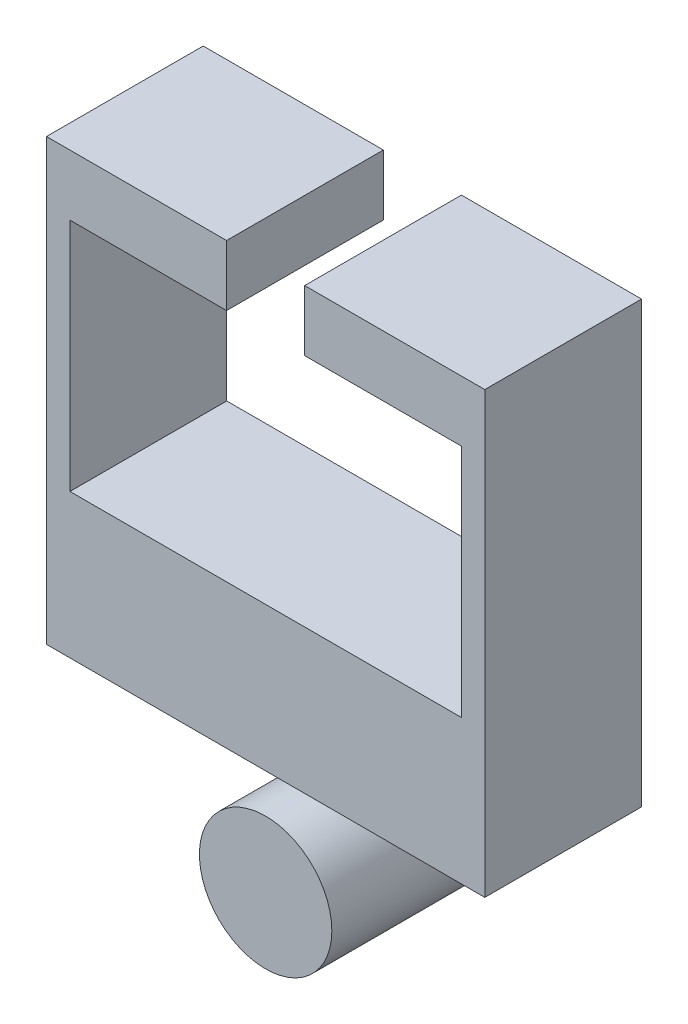
ISO-10303-21;
HEADER;
FILE_DESCRIPTION(('STEP AP214'),'2;1');
FILE_NAME('part.step','',(''),(''),'','','');
FILE_SCHEMA(('AUTOMOTIVE_DESIGN { 1 0 10303 214 1 1 1 1 }'));
ENDSEC;
DATA;
#1=APPLICATION_CONTEXT('core data for automotive mechanical design processes');
#2=APPLICATION_PROTOCOL_DEFINITION('international standard','automotive_design',2000,#1);
#3=PRODUCT_CONTEXT('',#1,'mechanical');
#4=PRODUCT('Part','Part','',(#3));
#5=PRODUCT_RELATED_PRODUCT_CATEGORY('part','',(#4));
#6=PRODUCT_DEFINITION_FORMATION('','',#4);
#7=PRODUCT_DEFINITION_CONTEXT('part definition',#1,'design');
#8=PRODUCT_DEFINITION('design','',#6,#7);
#9=PRODUCT_DEFINITION_SHAPE('','',#8);
#10=(LENGTH_UNIT() NAMED_UNIT(*) SI_UNIT(.MILLI.,.METRE.));
#11=(NAMED_UNIT(*) PLANE_ANGLE_UNIT() SI_UNIT($,.RADIAN.));
#12=(NAMED_UNIT(*) SI_UNIT($,.STERADIAN.) SOLID_ANGLE_UNIT());
#13=UNCERTAINTY_MEASURE_WITH_UNIT(LENGTH_MEASURE(1.E-05),#10,'distance_accuracy_value','');
#14=(GEOMETRIC_REPRESENTATION_CONTEXT(3) GLOBAL_UNCERTAINTY_ASSIGNED_CONTEXT((#13)) GLOBAL_UNIT_ASSIGNED_CONTEXT((#10,
#11,#12)) REPRESENTATION_CONTEXT('',''));
#15=CARTESIAN_POINT('',(0.,0.,0.));
#16=DIRECTION('',(0.,0.,1.));
#17=DIRECTION('',(1.,0.,0.));
#18=AXIS2_PLACEMENT_3D('',#15,#16,#17);
#19=CARTESIAN_POINT('',(0.,0.,25.4));
#20=DIRECTION('',(0.,0.,-1.));
#21=DIRECTION('',(-1.,0.,0.));
#22=AXIS2_PLACEMENT_3D('',#19,#20,#21);
#23=CYLINDRICAL_SURFACE('',#22,10.7286789250919);
#24=CARTESIAN_POINT('',(0.,0.,25.4));
#25=DIRECTION('',(0.,0.,1.));
#26=DIRECTION('',(1.,0.,0.));
#27=AXIS2_PLACEMENT_3D('',#24,#25,#26);
#28=CIRCLE('',#27,10.7286789250919);
#29=CARTESIAN_POINT('',(10.7286789250919,0.,25.4));
#30=VERTEX_POINT('',#29);
#31=EDGE_CURVE('E854',#30,#30,#28,.T.);
#32=ORIENTED_EDGE('',*,*,#31,.F.);
#33=EDGE_LOOP('',(#32));
#34=FACE_BOUND('',#33,.T.);
#35=DIRECTION('',(0.,0.,1.));
#36=VECTOR('',#35,1.);
#37=CARTESIAN_POINT('',(10.7286789250919,0.,0.));
#38=LINE('',#37,#36);
#39=CARTESIAN_POINT('',(10.7286789250919,0.,0.));
#40=VERTEX_POINT('',#39);
#41=CARTESIAN_POINT('',(10.7286789250919,0.,4.04101495652024));
#42=VERTEX_POINT('',#41);
#43=EDGE_CURVE('E865',#40,#42,#38,.T.);
#44=ORIENTED_EDGE('',*,*,#43,.T.);
#45=CARTESIAN_POINT('',(0.,0.,4.04101495652024));
#46=DIRECTION('',(0.,0.,-1.));
#47=DIRECTION('',(-1.,0.,0.));
#48=AXIS2_PLACEMENT_3D('',#45,#46,#47);
#49=CIRCLE('',#48,10.7286789250919);
#50=CARTESIAN_POINT('',(-10.7286789250919,0.,4.04101495652024));
#51=VERTEX_POINT('',#50);
#52=EDGE_CURVE('E14',#51,#42,#49,.T.);
#53=ORIENTED_EDGE('',*,*,#52,.F.);
#54=DIRECTION('',(0.,0.,-1.));
#55=VECTOR('',#54,1.);
#56=CARTESIAN_POINT('',(-10.7286789250919,0.,0.));
#57=LINE('',#56,#55);
#58=CARTESIAN_POINT('',(-10.7286789250919,0.,0.));
#59=VERTEX_POINT('',#58);
#60=EDGE_CURVE('E866',#51,#59,#57,.T.);
#61=ORIENTED_EDGE('',*,*,#60,.T.);
#62=CARTESIAN_POINT('',(0.,0.,0.));
#63=DIRECTION('',(0.,0.,1.));
#64=DIRECTION('',(1.,0.,0.));
#65=AXIS2_PLACEMENT_3D('',#62,#63,#64);
#66=CIRCLE('',#65,10.7286789250919);
#67=EDGE_CURVE('E1056',#59,#40,#66,.T.);
#68=ORIENTED_EDGE('',*,*,#67,.T.);
#69=EDGE_LOOP('',(#44,#53,#61,#68));
#70=FACE_BOUND('',#69,.T.);
#71=ADVANCED_FACE('F849',(#34,#70),#23,.T.);
#72=CARTESIAN_POINT('',(0.,0.,25.4));
#73=DIRECTION('',(0.,0.,1.));
#74=DIRECTION('',(1.,0.,0.));
#75=AXIS2_PLACEMENT_3D('',#72,#73,#74);
#76=PLANE('',#75);
#77=ORIENTED_EDGE('',*,*,#31,.T.);
#78=EDGE_LOOP('',(#77));
#79=FACE_BOUND('',#78,.T.);
#80=ADVANCED_FACE('F1203',(#79),#76,.T.);
#81=CARTESIAN_POINT('',(0.,0.,0.));
#82=DIRECTION('',(0.,0.,1.));
#83=DIRECTION('',(1.,0.,0.));
#84=AXIS2_PLACEMENT_3D('',#81,#82,#83);
#85=PLANE('',#84);
#86=ORIENTED_EDGE('',*,*,#67,.F.);
#87=DIRECTION('',(0.,1.,0.));
#88=VECTOR('',#87,1.);
#89=CARTESIAN_POINT('',(-10.7286789250919,0.,0.));
#90=LINE('',#89,#88);
#91=CARTESIAN_POINT('',(-10.7286789250919,17.0688,0.));
#92=VERTEX_POINT('',#91);
#93=EDGE_CURVE('E1059',#59,#92,#90,.T.);
#94=ORIENTED_EDGE('',*,*,#93,.T.);
#95=DIRECTION('',(1.,0.,0.));
#96=VECTOR('',#95,1.);
#97=CARTESIAN_POINT('',(-35.51174,17.0688,0.));
#98=LINE('',#97,#96);
#99=CARTESIAN_POINT('',(-35.51174,17.0688,0.));
#100=VERTEX_POINT('',#99);
#101=EDGE_CURVE('E984',#100,#92,#98,.T.);
#102=ORIENTED_EDGE('',*,*,#101,.F.);
#103=DIRECTION('',(0.,-1.,0.));
#104=VECTOR('',#103,1.);
#105=CARTESIAN_POINT('',(-35.51174,88.3367551933248,0.));
#106=LINE('',#105,#104);
#107=CARTESIAN_POINT('',(-35.51174,88.3367551933248,0.));
#108=VERTEX_POINT('',#107);
#109=EDGE_CURVE('E978',#108,#100,#106,.T.);
#110=ORIENTED_EDGE('',*,*,#109,.F.);
#111=DIRECTION('',(-1.,0.,0.));
#112=VECTOR('',#111,1.);
#113=CARTESIAN_POINT('',(-6.32459999999997,88.3367551933248,0.));
#114=LINE('',#113,#112);
#115=CARTESIAN_POINT('',(-6.32459999999997,88.3367551933248,0.));
#116=VERTEX_POINT('',#115);
#117=EDGE_CURVE('E960',#116,#108,#114,.T.);
#118=ORIENTED_EDGE('',*,*,#117,.F.);
#119=DIRECTION('',(0.,1.,0.));
#120=VECTOR('',#119,1.);
#121=CARTESIAN_POINT('',(-6.32459999999998,78.5033132323429,0.));
#122=LINE('',#121,#120);
#123=CARTESIAN_POINT('',(-6.32459999999998,78.5033132323429,0.));
#124=VERTEX_POINT('',#123);
#125=EDGE_CURVE('E973',#124,#116,#122,.T.);
#126=ORIENTED_EDGE('',*,*,#125,.F.);
#127=DIRECTION('',(1.,0.,0.));
#128=VECTOR('',#127,1.);
#129=CARTESIAN_POINT('',(-31.70428,78.5033132323429,0.));
#130=LINE('',#129,#128);
#131=CARTESIAN_POINT('',(-31.70428,78.5033132323429,0.));
#132=VERTEX_POINT('',#131);
#133=EDGE_CURVE('E1121',#132,#124,#130,.T.);
#134=ORIENTED_EDGE('',*,*,#133,.F.);
#135=DIRECTION('',(0.,1.,0.));
#136=VECTOR('',#135,1.);
#137=CARTESIAN_POINT('',(-31.70428,40.4287132323429,0.));
#138=LINE('',#137,#136);
#139=CARTESIAN_POINT('',(-31.70428,40.4287132323429,0.));
#140=VERTEX_POINT('',#139);
#141=EDGE_CURVE('E1127',#140,#132,#138,.T.);
#142=ORIENTED_EDGE('',*,*,#141,.F.);
#143=DIRECTION('',(-1.,0.,0.));
#144=VECTOR('',#143,1.);
#145=CARTESIAN_POINT('',(31.70428,40.4287132323429,0.));
#146=LINE('',#145,#144);
#147=CARTESIAN_POINT('',(31.70428,40.4287132323429,0.));
#148=VERTEX_POINT('',#147);
#149=EDGE_CURVE('E1133',#148,#140,#146,.T.);
#150=ORIENTED_EDGE('',*,*,#149,.F.);
#151=DIRECTION('',(0.,-1.,0.));
#152=VECTOR('',#151,1.);
#153=CARTESIAN_POINT('',(31.70428,78.5033132323429,0.));
#154=LINE('',#153,#152);
#155=CARTESIAN_POINT('',(31.70428,78.5033132323429,0.));
#156=VERTEX_POINT('',#155);
#157=EDGE_CURVE('E1135',#156,#148,#154,.T.);
#158=ORIENTED_EDGE('',*,*,#157,.F.);
#159=DIRECTION('',(1.,0.,0.));
#160=VECTOR('',#159,1.);
#161=CARTESIAN_POINT('',(6.32459999999998,78.5033132323429,0.));
#162=LINE('',#161,#160);
#163=CARTESIAN_POINT('',(6.32459999999998,78.5033132323429,0.));
#164=VERTEX_POINT('',#163);
#165=EDGE_CURVE('E1140',#164,#156,#162,.T.);
#166=ORIENTED_EDGE('',*,*,#165,.F.);
#167=DIRECTION('',(0.,-1.,0.));
#168=VECTOR('',#167,1.);
#169=CARTESIAN_POINT('',(6.32459999999998,88.3367551933248,0.));
#170=LINE('',#169,#168);
#171=CARTESIAN_POINT('',(6.32459999999998,88.3367551933248,0.));
#172=VERTEX_POINT('',#171);
#173=EDGE_CURVE('E1137',#172,#164,#170,.T.);
#174=ORIENTED_EDGE('',*,*,#173,.F.);
#175=DIRECTION('',(-1.,0.,0.));
#176=VECTOR('',#175,1.);
#177=CARTESIAN_POINT('',(35.51174,88.3367551933248,0.));
#178=LINE('',#177,#176);
#179=CARTESIAN_POINT('',(35.51174,88.3367551933248,0.));
#180=VERTEX_POINT('',#179);
#181=EDGE_CURVE('E1143',#180,#172,#178,.T.);
#182=ORIENTED_EDGE('',*,*,#181,.F.);
#183=DIRECTION('',(0.,1.,0.));
#184=VECTOR('',#183,1.);
#185=CARTESIAN_POINT('',(35.51174,17.0688,0.));
#186=LINE('',#185,#184);
#187=CARTESIAN_POINT('',(35.51174,17.0688,0.));
#188=VERTEX_POINT('',#187);
#189=EDGE_CURVE('E1144',#188,#180,#186,.T.);
#190=ORIENTED_EDGE('',*,*,#189,.F.);
#191=CARTESIAN_POINT('',(10.7286789250919,17.0688,0.));
#192=VERTEX_POINT('',#191);
#193=EDGE_CURVE('E998',#192,#188,#98,.T.);
#194=ORIENTED_EDGE('',*,*,#193,.F.);
#195=DIRECTION('',(0.,1.,0.));
#196=VECTOR('',#195,1.);
#197=CARTESIAN_POINT('',(10.7286789250919,0.,0.));
#198=LINE('',#197,#196);
#199=EDGE_CURVE('E1052',#40,#192,#198,.T.);
#200=ORIENTED_EDGE('',*,*,#199,.F.);
#201=EDGE_LOOP('',(#86,#94,#102,#110,#118,#126,#134,#142,#150,#158,#166,#174,#182,#190,#194,#200));
#202=FACE_BOUND('',#201,.T.);
#203=ADVANCED_FACE('F983',(#202),#85,.F.);
#204=CARTESIAN_POINT('',(-10.7286789250919,0.,0.));
#205=DIRECTION('',(1.,0.,0.));
#206=DIRECTION('',(0.,0.,-1.));
#207=AXIS2_PLACEMENT_3D('',#204,#205,#206);
#208=PLANE('',#207);
#209=DIRECTION('',(0.,0.,-1.));
#210=VECTOR('',#209,1.);
#211=CARTESIAN_POINT('',(-10.7286789250919,17.0688,0.));
#212=LINE('',#211,#210);
#213=CARTESIAN_POINT('',(-10.7286789250919,17.0688,4.04101495652024));
#214=VERTEX_POINT('',#213);
#215=EDGE_CURVE('E987',#214,#92,#212,.T.);
#216=ORIENTED_EDGE('',*,*,#215,.T.);
#217=ORIENTED_EDGE('',*,*,#93,.F.);
#218=ORIENTED_EDGE('',*,*,#60,.F.);
#219=DIRECTION('',(0.,1.,0.));
#220=VECTOR('',#219,1.);
#221=CARTESIAN_POINT('',(-10.7286789250919,0.,4.04101495652024));
#222=LINE('',#221,#220);
#223=EDGE_CURVE('E1038',#51,#214,#222,.T.);
#224=ORIENTED_EDGE('',*,*,#223,.T.);
#225=EDGE_LOOP('',(#216,#217,#218,#224));
#226=FACE_BOUND('',#225,.T.);
#227=ADVANCED_FACE('F1078',(#226),#208,.F.);
#228=CARTESIAN_POINT('',(10.7286789250919,0.,0.));
#229=DIRECTION('',(-1.,0.,0.));
#230=DIRECTION('',(0.,0.,1.));
#231=AXIS2_PLACEMENT_3D('',#228,#229,#230);
#232=PLANE('',#231);
#233=DIRECTION('',(0.,0.,1.));
#234=VECTOR('',#233,1.);
#235=CARTESIAN_POINT('',(10.7286789250919,17.0688,0.));
#236=LINE('',#235,#234);
#237=CARTESIAN_POINT('',(10.7286789250919,17.0688,4.04101495652024));
#238=VERTEX_POINT('',#237);
#239=EDGE_CURVE('E991',#192,#238,#236,.T.);
#240=ORIENTED_EDGE('',*,*,#239,.T.);
#241=DIRECTION('',(0.,1.,0.));
#242=VECTOR('',#241,1.);
#243=CARTESIAN_POINT('',(10.7286789250919,0.,4.04101495652024));
#244=LINE('',#243,#242);
#245=EDGE_CURVE('E1046',#42,#238,#244,.T.);
#246=ORIENTED_EDGE('',*,*,#245,.F.);
#247=ORIENTED_EDGE('',*,*,#43,.F.);
#248=ORIENTED_EDGE('',*,*,#199,.T.);
#249=EDGE_LOOP('',(#240,#246,#247,#248));
#250=FACE_BOUND('',#249,.T.);
#251=ADVANCED_FACE('F1071',(#250),#232,.F.);
#252=CARTESIAN_POINT('',(-10.7286789250919,0.,4.04101495652024));
#253=DIRECTION('',(0.,0.,-1.));
#254=DIRECTION('',(-1.,0.,0.));
#255=AXIS2_PLACEMENT_3D('',#252,#253,#254);
#256=PLANE('',#255);
#257=ORIENTED_EDGE('',*,*,#223,.F.);
#258=ORIENTED_EDGE('',*,*,#52,.T.);
#259=ORIENTED_EDGE('',*,*,#245,.T.);
#260=DIRECTION('',(-1.,0.,0.));
#261=VECTOR('',#260,1.);
#262=CARTESIAN_POINT('',(-10.7286789250919,17.0688,4.04101495652024));
#263=LINE('',#262,#261);
#264=EDGE_CURVE('E1036',#238,#214,#263,.T.);
#265=ORIENTED_EDGE('',*,*,#264,.T.);
#266=EDGE_LOOP('',(#257,#258,#259,#265));
#267=FACE_BOUND('',#266,.T.);
#268=ADVANCED_FACE('F1073',(#267),#256,.F.);
#269=CARTESIAN_POINT('',(-35.51174,88.3367551933248,25.4));
#270=DIRECTION('',(1.,0.,0.));
#271=DIRECTION('',(0.,1.,0.));
#272=AXIS2_PLACEMENT_3D('',#269,#270,#271);
#273=PLANE('',#272);
#274=ORIENTED_EDGE('',*,*,#109,.T.);
#275=DIRECTION('',(0.,0.,-1.));
#276=VECTOR('',#275,1.);
#277=CARTESIAN_POINT('',(-35.51174,17.0688,25.4));
#278=LINE('',#277,#276);
#279=CARTESIAN_POINT('',(-35.51174,17.0688,25.4));
#280=VERTEX_POINT('',#279);
#281=EDGE_CURVE('E1080',#280,#100,#278,.T.);
#282=ORIENTED_EDGE('',*,*,#281,.F.);
#283=DIRECTION('',(0.,-1.,0.));
#284=VECTOR('',#283,1.);
#285=CARTESIAN_POINT('',(-35.51174,88.3367551933248,25.4));
#286=LINE('',#285,#284);
#287=CARTESIAN_POINT('',(-35.51174,88.3367551933248,25.4));
#288=VERTEX_POINT('',#287);
#289=EDGE_CURVE('E975',#288,#280,#286,.T.);
#290=ORIENTED_EDGE('',*,*,#289,.F.);
#291=DIRECTION('',(0.,0.,-1.));
#292=VECTOR('',#291,1.);
#293=CARTESIAN_POINT('',(-35.51174,88.3367551933248,25.4));
#294=LINE('',#293,#292);
#295=EDGE_CURVE('E962',#288,#108,#294,.T.);
#296=ORIENTED_EDGE('',*,*,#295,.T.);
#297=EDGE_LOOP('',(#274,#282,#290,#296));
#298=FACE_BOUND('',#297,.T.);
#299=ADVANCED_FACE('F976',(#298),#273,.F.);
#300=CARTESIAN_POINT('',(-35.51174,17.0688,25.4));
#301=DIRECTION('',(0.,1.,0.));
#302=DIRECTION('',(-1.,0.,0.));
#303=AXIS2_PLACEMENT_3D('',#300,#301,#302);
#304=PLANE('',#303);
#305=ORIENTED_EDGE('',*,*,#215,.F.);
#306=ORIENTED_EDGE('',*,*,#264,.F.);
#307=ORIENTED_EDGE('',*,*,#239,.F.);
#308=ORIENTED_EDGE('',*,*,#193,.T.);
#309=DIRECTION('',(0.,0.,-1.));
#310=VECTOR('',#309,1.);
#311=CARTESIAN_POINT('',(35.51174,17.0688,25.4));
#312=LINE('',#311,#310);
#313=CARTESIAN_POINT('',(35.51174,17.0688,25.4));
#314=VERTEX_POINT('',#313);
#315=EDGE_CURVE('E1085',#314,#188,#312,.T.);
#316=ORIENTED_EDGE('',*,*,#315,.F.);
#317=DIRECTION('',(1.,0.,0.));
#318=VECTOR('',#317,1.);
#319=CARTESIAN_POINT('',(-35.51174,17.0688,25.4));
#320=LINE('',#319,#318);
#321=EDGE_CURVE('E1029',#280,#314,#320,.T.);
#322=ORIENTED_EDGE('',*,*,#321,.F.);
#323=ORIENTED_EDGE('',*,*,#281,.T.);
#324=ORIENTED_EDGE('',*,*,#101,.T.);
#325=EDGE_LOOP('',(#305,#306,#307,#308,#316,#322,#323,#324));
#326=FACE_BOUND('',#325,.T.);
#327=ADVANCED_FACE('F1076',(#326),#304,.F.);
#328=CARTESIAN_POINT('',(35.51174,17.0688,25.4));
#329=DIRECTION('',(-1.,0.,0.));
#330=DIRECTION('',(0.,-1.,0.));
#331=AXIS2_PLACEMENT_3D('',#328,#329,#330);
#332=PLANE('',#331);
#333=ORIENTED_EDGE('',*,*,#189,.T.);
#334=DIRECTION('',(0.,0.,-1.));
#335=VECTOR('',#334,1.);
#336=CARTESIAN_POINT('',(35.51174,88.3367551933248,25.4));
#337=LINE('',#336,#335);
#338=CARTESIAN_POINT('',(35.51174,88.3367551933248,25.4));
#339=VERTEX_POINT('',#338);
#340=EDGE_CURVE('E1090',#339,#180,#337,.T.);
#341=ORIENTED_EDGE('',*,*,#340,.F.);
#342=DIRECTION('',(0.,1.,0.));
#343=VECTOR('',#342,1.);
#344=CARTESIAN_POINT('',(35.51174,17.0688,25.4));
#345=LINE('',#344,#343);
#346=EDGE_CURVE('E1028',#314,#339,#345,.T.);
#347=ORIENTED_EDGE('',*,*,#346,.F.);
#348=ORIENTED_EDGE('',*,*,#315,.T.);
#349=EDGE_LOOP('',(#333,#341,#347,#348));
#350=FACE_BOUND('',#349,.T.);
#351=ADVANCED_FACE('F1152',(#350),#332,.F.);
#352=CARTESIAN_POINT('',(35.51174,88.3367551933248,25.4));
#353=DIRECTION('',(0.,-1.,0.));
#354=DIRECTION('',(1.,0.,0.));
#355=AXIS2_PLACEMENT_3D('',#352,#353,#354);
#356=PLANE('',#355);
#357=ORIENTED_EDGE('',*,*,#181,.T.);
#358=DIRECTION('',(0.,0.,-1.));
#359=VECTOR('',#358,1.);
#360=CARTESIAN_POINT('',(6.32459999999998,88.3367551933248,25.4));
#361=LINE('',#360,#359);
#362=CARTESIAN_POINT('',(6.32459999999998,88.3367551933248,25.4));
#363=VERTEX_POINT('',#362);
#364=EDGE_CURVE('E1093',#363,#172,#361,.T.);
#365=ORIENTED_EDGE('',*,*,#364,.F.);
#366=DIRECTION('',(-1.,0.,0.));
#367=VECTOR('',#366,1.);
#368=CARTESIAN_POINT('',(35.51174,88.3367551933248,25.4));
#369=LINE('',#368,#367);
#370=EDGE_CURVE('E1021',#339,#363,#369,.T.);
#371=ORIENTED_EDGE('',*,*,#370,.F.);
#372=ORIENTED_EDGE('',*,*,#340,.T.);
#373=EDGE_LOOP('',(#357,#365,#371,#372));
#374=FACE_BOUND('',#373,.T.);
#375=ADVANCED_FACE('F1156',(#374),#356,.F.);
#376=CARTESIAN_POINT('',(6.32459999999998,88.3367551933248,25.4));
#377=DIRECTION('',(1.,0.,0.));
#378=DIRECTION('',(0.,0.,-1.));
#379=AXIS2_PLACEMENT_3D('',#376,#377,#378);
#380=PLANE('',#379);
#381=ORIENTED_EDGE('',*,*,#173,.T.);
#382=DIRECTION('',(0.,0.,-1.));
#383=VECTOR('',#382,1.);
#384=CARTESIAN_POINT('',(6.32459999999998,78.5033132323429,25.4));
#385=LINE('',#384,#383);
#386=CARTESIAN_POINT('',(6.32459999999998,78.5033132323429,25.4));
#387=VERTEX_POINT('',#386);
#388=EDGE_CURVE('E1100',#387,#164,#385,.T.);
#389=ORIENTED_EDGE('',*,*,#388,.F.);
#390=DIRECTION('',(0.,-1.,0.));
#391=VECTOR('',#390,1.);
#392=CARTESIAN_POINT('',(6.32459999999998,88.3367551933248,25.4));
#393=LINE('',#392,#391);
#394=EDGE_CURVE('E1019',#363,#387,#393,.T.);
#395=ORIENTED_EDGE('',*,*,#394,.F.);
#396=ORIENTED_EDGE('',*,*,#364,.T.);
#397=EDGE_LOOP('',(#381,#389,#395,#396));
#398=FACE_BOUND('',#397,.T.);
#399=ADVANCED_FACE('F1162',(#398),#380,.F.);
#400=CARTESIAN_POINT('',(6.32459999999998,78.5033132323429,25.4));
#401=DIRECTION('',(0.,1.,0.));
#402=DIRECTION('',(-1.,0.,0.));
#403=AXIS2_PLACEMENT_3D('',#400,#401,#402);
#404=PLANE('',#403);
#405=ORIENTED_EDGE('',*,*,#165,.T.);
#406=DIRECTION('',(0.,0.,-1.));
#407=VECTOR('',#406,1.);
#408=CARTESIAN_POINT('',(31.70428,78.5033132323429,25.4));
#409=LINE('',#408,#407);
#410=CARTESIAN_POINT('',(31.70428,78.5033132323429,25.4));
#411=VERTEX_POINT('',#410);
#412=EDGE_CURVE('E1102',#411,#156,#409,.T.);
#413=ORIENTED_EDGE('',*,*,#412,.F.);
#414=DIRECTION('',(1.,0.,0.));
#415=VECTOR('',#414,1.);
#416=CARTESIAN_POINT('',(6.32459999999998,78.5033132323429,25.4));
#417=LINE('',#416,#415);
#418=EDGE_CURVE('E1020',#387,#411,#417,.T.);
#419=ORIENTED_EDGE('',*,*,#418,.F.);
#420=ORIENTED_EDGE('',*,*,#388,.T.);
#421=EDGE_LOOP('',(#405,#413,#419,#420));
#422=FACE_BOUND('',#421,.T.);
#423=ADVANCED_FACE('F1191',(#422),#404,.F.);
#424=CARTESIAN_POINT('',(31.70428,78.5033132323429,25.4));
#425=DIRECTION('',(1.,0.,0.));
#426=DIRECTION('',(0.,1.,0.));
#427=AXIS2_PLACEMENT_3D('',#424,#425,#426);
#428=PLANE('',#427);
#429=ORIENTED_EDGE('',*,*,#157,.T.);
#430=DIRECTION('',(0.,0.,-1.));
#431=VECTOR('',#430,1.);
#432=CARTESIAN_POINT('',(31.70428,40.4287132323429,25.4));
#433=LINE('',#432,#431);
#434=CARTESIAN_POINT('',(31.70428,40.4287132323429,25.4));
#435=VERTEX_POINT('',#434);
#436=EDGE_CURVE('E1103',#435,#148,#433,.T.);
#437=ORIENTED_EDGE('',*,*,#436,.F.);
#438=DIRECTION('',(0.,-1.,0.));
#439=VECTOR('',#438,1.);
#440=CARTESIAN_POINT('',(31.70428,78.5033132323429,25.4));
#441=LINE('',#440,#439);
#442=EDGE_CURVE('E1015',#411,#435,#441,.T.);
#443=ORIENTED_EDGE('',*,*,#442,.F.);
#444=ORIENTED_EDGE('',*,*,#412,.T.);
#445=EDGE_LOOP('',(#429,#437,#443,#444));
#446=FACE_BOUND('',#445,.T.);
#447=ADVANCED_FACE('F1189',(#446),#428,.F.);
#448=CARTESIAN_POINT('',(31.70428,40.4287132323429,25.4));
#449=DIRECTION('',(0.,-1.,0.));
#450=DIRECTION('',(0.,0.,-1.));
#451=AXIS2_PLACEMENT_3D('',#448,#449,#450);
#452=PLANE('',#451);
#453=ORIENTED_EDGE('',*,*,#149,.T.);
#454=DIRECTION('',(0.,0.,-1.));
#455=VECTOR('',#454,1.);
#456=CARTESIAN_POINT('',(-31.70428,40.4287132323429,25.4));
#457=LINE('',#456,#455);
#458=CARTESIAN_POINT('',(-31.70428,40.4287132323429,25.4));
#459=VERTEX_POINT('',#458);
#460=EDGE_CURVE('E1110',#459,#140,#457,.T.);
#461=ORIENTED_EDGE('',*,*,#460,.F.);
#462=DIRECTION('',(-1.,0.,0.));
#463=VECTOR('',#462,1.);
#464=CARTESIAN_POINT('',(31.70428,40.4287132323429,25.4));
#465=LINE('',#464,#463);
#466=EDGE_CURVE('E1013',#435,#459,#465,.T.);
#467=ORIENTED_EDGE('',*,*,#466,.F.);
#468=ORIENTED_EDGE('',*,*,#436,.T.);
#469=EDGE_LOOP('',(#453,#461,#467,#468));
#470=FACE_BOUND('',#469,.T.);
#471=ADVANCED_FACE('F1188',(#470),#452,.F.);
#472=CARTESIAN_POINT('',(-31.70428,40.4287132323429,25.4));
#473=DIRECTION('',(-1.,0.,0.));
#474=DIRECTION('',(0.,0.,1.));
#475=AXIS2_PLACEMENT_3D('',#472,#473,#474);
#476=PLANE('',#475);
#477=ORIENTED_EDGE('',*,*,#141,.T.);
#478=DIRECTION('',(0.,0.,-1.));
#479=VECTOR('',#478,1.);
#480=CARTESIAN_POINT('',(-31.70428,78.5033132323429,25.4));
#481=LINE('',#480,#479);
#482=CARTESIAN_POINT('',(-31.70428,78.5033132323429,25.4));
#483=VERTEX_POINT('',#482);
#484=EDGE_CURVE('E1112',#483,#132,#481,.T.);
#485=ORIENTED_EDGE('',*,*,#484,.F.);
#486=DIRECTION('',(0.,1.,0.));
#487=VECTOR('',#486,1.);
#488=CARTESIAN_POINT('',(-31.70428,40.4287132323429,25.4));
#489=LINE('',#488,#487);
#490=EDGE_CURVE('E1006',#459,#483,#489,.T.);
#491=ORIENTED_EDGE('',*,*,#490,.F.);
#492=ORIENTED_EDGE('',*,*,#460,.T.);
#493=EDGE_LOOP('',(#477,#485,#491,#492));
#494=FACE_BOUND('',#493,.T.);
#495=ADVANCED_FACE('F1185',(#494),#476,.F.);
#496=CARTESIAN_POINT('',(-31.70428,78.5033132323429,25.4));
#497=DIRECTION('',(0.,1.,0.));
#498=DIRECTION('',(0.,0.,1.));
#499=AXIS2_PLACEMENT_3D('',#496,#497,#498);
#500=PLANE('',#499);
#501=ORIENTED_EDGE('',*,*,#133,.T.);
#502=DIRECTION('',(0.,0.,-1.));
#503=VECTOR('',#502,1.);
#504=CARTESIAN_POINT('',(-6.32459999999998,78.5033132323429,25.4));
#505=LINE('',#504,#503);
#506=CARTESIAN_POINT('',(-6.32459999999998,78.5033132323429,25.4));
#507=VERTEX_POINT('',#506);
#508=EDGE_CURVE('E1120',#507,#124,#505,.T.);
#509=ORIENTED_EDGE('',*,*,#508,.F.);
#510=DIRECTION('',(1.,0.,0.));
#511=VECTOR('',#510,1.);
#512=CARTESIAN_POINT('',(-31.70428,78.5033132323429,25.4));
#513=LINE('',#512,#511);
#514=EDGE_CURVE('E1001',#483,#507,#513,.T.);
#515=ORIENTED_EDGE('',*,*,#514,.F.);
#516=ORIENTED_EDGE('',*,*,#484,.T.);
#517=EDGE_LOOP('',(#501,#509,#515,#516));
#518=FACE_BOUND('',#517,.T.);
#519=ADVANCED_FACE('F1177',(#518),#500,.F.);
#520=CARTESIAN_POINT('',(-6.32459999999998,78.5033132323429,25.4));
#521=DIRECTION('',(-1.,0.,0.));
#522=DIRECTION('',(0.,-1.,0.));
#523=AXIS2_PLACEMENT_3D('',#520,#521,#522);
#524=PLANE('',#523);
#525=ORIENTED_EDGE('',*,*,#125,.T.);
#526=DIRECTION('',(0.,0.,-1.));
#527=VECTOR('',#526,1.);
#528=CARTESIAN_POINT('',(-6.32459999999997,88.3367551933248,25.4));
#529=LINE('',#528,#527);
#530=CARTESIAN_POINT('',(-6.32459999999997,88.3367551933248,25.4));
#531=VERTEX_POINT('',#530);
#532=EDGE_CURVE('E968',#531,#116,#529,.T.);
#533=ORIENTED_EDGE('',*,*,#532,.F.);
#534=DIRECTION('',(0.,1.,0.));
#535=VECTOR('',#534,1.);
#536=CARTESIAN_POINT('',(-6.32459999999998,78.5033132323429,25.4));
#537=LINE('',#536,#535);
#538=EDGE_CURVE('E1004',#507,#531,#537,.T.);
#539=ORIENTED_EDGE('',*,*,#538,.F.);
#540=ORIENTED_EDGE('',*,*,#508,.T.);
#541=EDGE_LOOP('',(#525,#533,#539,#540));
#542=FACE_BOUND('',#541,.T.);
#543=ADVANCED_FACE('F1171',(#542),#524,.F.);
#544=CARTESIAN_POINT('',(-6.32459999999997,88.3367551933248,25.4));
#545=DIRECTION('',(0.,-1.,0.));
#546=DIRECTION('',(1.,0.,0.));
#547=AXIS2_PLACEMENT_3D('',#544,#545,#546);
#548=PLANE('',#547);
#549=ORIENTED_EDGE('',*,*,#117,.T.);
#550=ORIENTED_EDGE('',*,*,#295,.F.);
#551=DIRECTION('',(-1.,0.,0.));
#552=VECTOR('',#551,1.);
#553=CARTESIAN_POINT('',(-6.32459999999997,88.3367551933248,25.4));
#554=LINE('',#553,#552);
#555=EDGE_CURVE('E981',#531,#288,#554,.T.);
#556=ORIENTED_EDGE('',*,*,#555,.F.);
#557=ORIENTED_EDGE('',*,*,#532,.T.);
#558=EDGE_LOOP('',(#549,#550,#556,#557));
#559=FACE_BOUND('',#558,.T.);
#560=ADVANCED_FACE('F961',(#559),#548,.F.);
#561=CARTESIAN_POINT('',(0.,0.,25.4));
#562=DIRECTION('',(0.,0.,1.));
#563=DIRECTION('',(1.,0.,0.));
#564=AXIS2_PLACEMENT_3D('',#561,#562,#563);
#565=PLANE('',#564);
#566=ORIENTED_EDGE('',*,*,#289,.T.);
#567=ORIENTED_EDGE('',*,*,#321,.T.);
#568=ORIENTED_EDGE('',*,*,#346,.T.);
#569=ORIENTED_EDGE('',*,*,#370,.T.);
#570=ORIENTED_EDGE('',*,*,#394,.T.);
#571=ORIENTED_EDGE('',*,*,#418,.T.);
#572=ORIENTED_EDGE('',*,*,#442,.T.);
#573=ORIENTED_EDGE('',*,*,#466,.T.);
#574=ORIENTED_EDGE('',*,*,#490,.T.);
#575=ORIENTED_EDGE('',*,*,#514,.T.);
#576=ORIENTED_EDGE('',*,*,#538,.T.);
#577=ORIENTED_EDGE('',*,*,#555,.T.);
#578=EDGE_LOOP('',(#566,#567,#568,#569,#570,#571,#572,#573,#574,#575,#576,#577));
#579=FACE_BOUND('',#578,.T.);
#580=ADVANCED_FACE('F1169',(#579),#565,.T.);
#581=CLOSED_SHELL('',(#71,#80,#203,#227,#251,#268,#299,#327,#351,#375,#399,#423,#447,#471,#495,
#519,#543,#560,#580));
#582=MANIFOLD_SOLID_BREP('B2',#581);
#583=ADVANCED_BREP_SHAPE_REPRESENTATION('',(#18,#582),#14);
#584=SHAPE_DEFINITION_REPRESENTATION(#9,#583);
ENDSEC;
END-ISO-10303-21;
